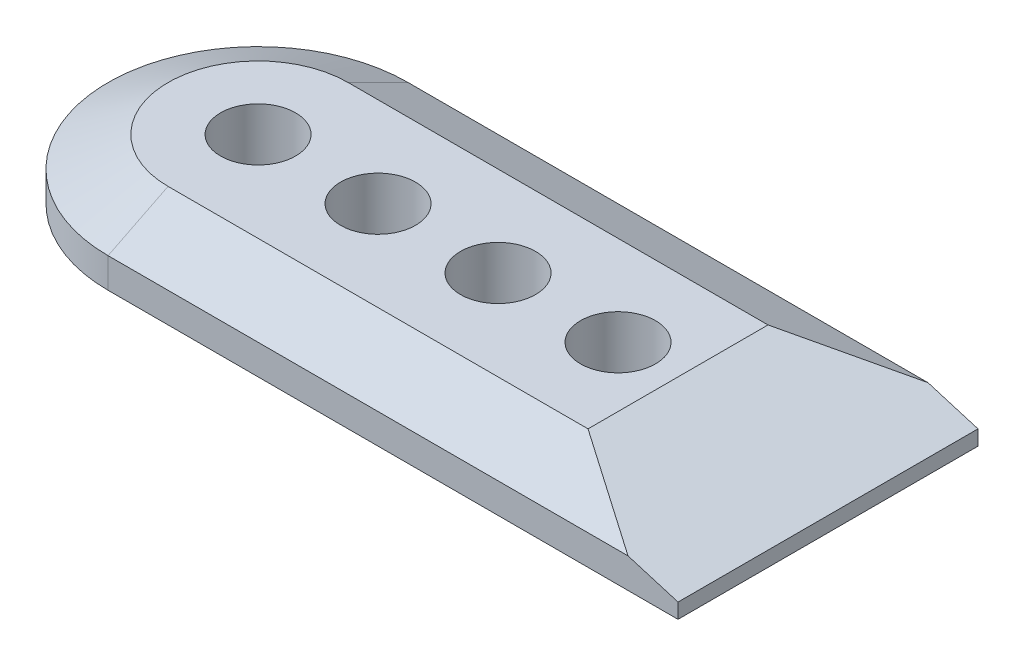
ISO-10303-21;
HEADER;
FILE_DESCRIPTION(('STEP AP214'),'2;1');
FILE_NAME('part.step','',(''),(''),'','','');
FILE_SCHEMA(('AUTOMOTIVE_DESIGN { 1 0 10303 214 1 1 1 1 }'));
ENDSEC;
DATA;
#1=APPLICATION_CONTEXT('core data for automotive mechanical design processes');
#2=APPLICATION_PROTOCOL_DEFINITION('international standard','automotive_design',2000,#1);
#3=PRODUCT_CONTEXT('',#1,'mechanical');
#4=PRODUCT('Part','Part','',(#3));
#5=PRODUCT_RELATED_PRODUCT_CATEGORY('part','',(#4));
#6=PRODUCT_DEFINITION_FORMATION('','',#4);
#7=PRODUCT_DEFINITION_CONTEXT('part definition',#1,'design');
#8=PRODUCT_DEFINITION('design','',#6,#7);
#9=PRODUCT_DEFINITION_SHAPE('','',#8);
#10=(LENGTH_UNIT() NAMED_UNIT(*) SI_UNIT(.MILLI.,.METRE.));
#11=(NAMED_UNIT(*) PLANE_ANGLE_UNIT() SI_UNIT($,.RADIAN.));
#12=(NAMED_UNIT(*) SI_UNIT($,.STERADIAN.) SOLID_ANGLE_UNIT());
#13=UNCERTAINTY_MEASURE_WITH_UNIT(LENGTH_MEASURE(1.E-05),#10,'distance_accuracy_value','');
#14=(GEOMETRIC_REPRESENTATION_CONTEXT(3) GLOBAL_UNCERTAINTY_ASSIGNED_CONTEXT((#13)) GLOBAL_UNIT_ASSIGNED_CONTEXT((#10,
#11,#12)) REPRESENTATION_CONTEXT('',''));
#15=CARTESIAN_POINT('',(0.,0.,0.));
#16=DIRECTION('',(0.,0.,1.));
#17=DIRECTION('',(1.,0.,0.));
#18=AXIS2_PLACEMENT_3D('',#15,#16,#17);
#19=CARTESIAN_POINT('',(-120.65,12.7,-31.75));
#20=DIRECTION('',(0.,-1.,0.));
#21=DIRECTION('',(0.,0.,-1.));
#22=AXIS2_PLACEMENT_3D('',#19,#20,#21);
#23=CYLINDRICAL_SURFACE('',#22,31.75);
#24=DIRECTION('',(0.,-1.,0.));
#25=VECTOR('',#24,1.);
#26=CARTESIAN_POINT('',(-120.65,12.7,0.));
#27=LINE('',#26,#25);
#28=CARTESIAN_POINT('',(-120.65,6.34999999999998,0.));
#29=VERTEX_POINT('',#28);
#30=CARTESIAN_POINT('',(-120.65,0.,0.));
#31=VERTEX_POINT('',#30);
#32=EDGE_CURVE('E97',#29,#31,#27,.T.);
#33=ORIENTED_EDGE('',*,*,#32,.F.);
#34=CARTESIAN_POINT('',(-120.65,6.34999999999998,-31.75));
#35=DIRECTION('',(0.,1.,0.));
#36=DIRECTION('',(0.,0.,1.));
#37=AXIS2_PLACEMENT_3D('',#34,#35,#36);
#38=CIRCLE('',#37,31.75);
#39=CARTESIAN_POINT('',(-120.65,6.34999999999998,-63.5));
#40=VERTEX_POINT('',#39);
#41=EDGE_CURVE('E47',#29,#40,#38,.F.);
#42=ORIENTED_EDGE('',*,*,#41,.T.);
#43=DIRECTION('',(0.,-1.,0.));
#44=VECTOR('',#43,1.);
#45=CARTESIAN_POINT('',(-120.65,12.7,-63.5));
#46=LINE('',#45,#44);
#47=CARTESIAN_POINT('',(-120.65,0.,-63.5));
#48=VERTEX_POINT('',#47);
#49=EDGE_CURVE('E118',#40,#48,#46,.T.);
#50=ORIENTED_EDGE('',*,*,#49,.T.);
#51=CARTESIAN_POINT('',(-120.65,0.,-31.75));
#52=DIRECTION('',(0.,1.,0.));
#53=DIRECTION('',(0.,0.,1.));
#54=AXIS2_PLACEMENT_3D('',#51,#52,#53);
#55=CIRCLE('',#54,31.75);
#56=EDGE_CURVE('E113',#48,#31,#55,.T.);
#57=ORIENTED_EDGE('',*,*,#56,.T.);
#58=EDGE_LOOP('',(#33,#42,#50,#57));
#59=FACE_BOUND('',#58,.T.);
#60=ADVANCED_FACE('F37',(#59),#23,.T.);
#61=CARTESIAN_POINT('',(-120.65,12.7,0.));
#62=DIRECTION('',(0.,0.,-1.));
#63=DIRECTION('',(-1.,0.,0.));
#64=AXIS2_PLACEMENT_3D('',#61,#62,#63);
#65=PLANE('',#64);
#66=DIRECTION('',(-0.957826285221152,0.287347885566343,0.));
#67=VECTOR('',#66,1.);
#68=CARTESIAN_POINT('',(-31.7500000000003,12.7,0.));
#69=LINE('',#68,#67);
#70=CARTESIAN_POINT('',(0.,3.17499999999999,0.));
#71=VERTEX_POINT('',#70);
#72=CARTESIAN_POINT('',(-10.5833333333334,6.34999999999998,0.));
#73=VERTEX_POINT('',#72);
#74=EDGE_CURVE('E140',#71,#73,#69,.T.);
#75=ORIENTED_EDGE('',*,*,#74,.T.);
#76=DIRECTION('',(-1.,0.,0.));
#77=VECTOR('',#76,1.);
#78=CARTESIAN_POINT('',(-120.65,6.34999999999998,0.));
#79=LINE('',#78,#77);
#80=EDGE_CURVE('E11',#73,#29,#79,.T.);
#81=ORIENTED_EDGE('',*,*,#80,.T.);
#82=ORIENTED_EDGE('',*,*,#32,.T.);
#83=DIRECTION('',(1.,0.,0.));
#84=VECTOR('',#83,1.);
#85=CARTESIAN_POINT('',(-120.65,0.,0.));
#86=LINE('',#85,#84);
#87=CARTESIAN_POINT('',(0.,0.,0.));
#88=VERTEX_POINT('',#87);
#89=EDGE_CURVE('E101',#31,#88,#86,.T.);
#90=ORIENTED_EDGE('',*,*,#89,.T.);
#91=DIRECTION('',(0.,-1.,0.));
#92=VECTOR('',#91,1.);
#93=CARTESIAN_POINT('',(0.,12.7,0.));
#94=LINE('',#93,#92);
#95=EDGE_CURVE('E107',#71,#88,#94,.T.);
#96=ORIENTED_EDGE('',*,*,#95,.F.);
#97=EDGE_LOOP('',(#75,#81,#82,#90,#96));
#98=FACE_BOUND('',#97,.T.);
#99=ADVANCED_FACE('F99',(#98),#65,.F.);
#100=CARTESIAN_POINT('',(0.,12.7,0.));
#101=DIRECTION('',(-1.,0.,0.));
#102=DIRECTION('',(0.,0.,1.));
#103=AXIS2_PLACEMENT_3D('',#100,#101,#102);
#104=PLANE('',#103);
#105=DIRECTION('',(0.,-1.,0.));
#106=VECTOR('',#105,1.);
#107=CARTESIAN_POINT('',(0.,12.7,-63.4999999999999));
#108=LINE('',#107,#106);
#109=CARTESIAN_POINT('',(0.,3.17499999999999,-63.4999999999999));
#110=VERTEX_POINT('',#109);
#111=CARTESIAN_POINT('',(0.,0.,-63.4999999999999));
#112=VERTEX_POINT('',#111);
#113=EDGE_CURVE('E131',#110,#112,#108,.T.);
#114=ORIENTED_EDGE('',*,*,#113,.F.);
#115=DIRECTION('',(0.,0.,1.));
#116=VECTOR('',#115,1.);
#117=CARTESIAN_POINT('',(0.,3.17499999999999,0.));
#118=LINE('',#117,#116);
#119=EDGE_CURVE('E138',#110,#71,#118,.T.);
#120=ORIENTED_EDGE('',*,*,#119,.T.);
#121=ORIENTED_EDGE('',*,*,#95,.T.);
#122=DIRECTION('',(0.,0.,-1.));
#123=VECTOR('',#122,1.);
#124=CARTESIAN_POINT('',(0.,0.,0.));
#125=LINE('',#124,#123);
#126=EDGE_CURVE('E115',#88,#112,#125,.T.);
#127=ORIENTED_EDGE('',*,*,#126,.T.);
#128=EDGE_LOOP('',(#114,#120,#121,#127));
#129=FACE_BOUND('',#128,.T.);
#130=ADVANCED_FACE('F203',(#129),#104,.F.);
#131=CARTESIAN_POINT('',(0.,12.7,-63.4999999999999));
#132=DIRECTION('',(0.,0.,1.));
#133=DIRECTION('',(1.,0.,0.));
#134=AXIS2_PLACEMENT_3D('',#131,#132,#133);
#135=PLANE('',#134);
#136=ORIENTED_EDGE('',*,*,#49,.F.);
#137=DIRECTION('',(1.,0.,0.));
#138=VECTOR('',#137,1.);
#139=CARTESIAN_POINT('',(-31.7500000000003,6.34999999999998,-63.4999999999999));
#140=LINE('',#139,#138);
#141=CARTESIAN_POINT('',(-10.5833333333334,6.34999999999998,-63.4999999999999));
#142=VERTEX_POINT('',#141);
#143=EDGE_CURVE('E149',#40,#142,#140,.T.);
#144=ORIENTED_EDGE('',*,*,#143,.T.);
#145=DIRECTION('',(0.957826285221152,-0.287347885566343,0.));
#146=VECTOR('',#145,1.);
#147=CARTESIAN_POINT('',(-31.7500000000003,12.7,-63.4999999999999));
#148=LINE('',#147,#146);
#149=EDGE_CURVE('E136',#142,#110,#148,.T.);
#150=ORIENTED_EDGE('',*,*,#149,.T.);
#151=ORIENTED_EDGE('',*,*,#113,.T.);
#152=DIRECTION('',(-1.,0.,0.));
#153=VECTOR('',#152,1.);
#154=CARTESIAN_POINT('',(0.,0.,-63.4999999999999));
#155=LINE('',#154,#153);
#156=EDGE_CURVE('E128',#112,#48,#155,.T.);
#157=ORIENTED_EDGE('',*,*,#156,.T.);
#158=EDGE_LOOP('',(#136,#144,#150,#151,#157));
#159=FACE_BOUND('',#158,.T.);
#160=ADVANCED_FACE('F191',(#159),#135,.F.);
#161=CARTESIAN_POINT('',(-120.65,12.7,-31.75));
#162=DIRECTION('',(0.,1.,0.));
#163=DIRECTION('',(0.,0.,1.));
#164=AXIS2_PLACEMENT_3D('',#161,#162,#163);
#165=PLANE('',#164);
#166=CARTESIAN_POINT('',(-120.65,12.7,-31.75));
#167=DIRECTION('',(0.,1.,0.));
#168=DIRECTION('',(0.,0.,1.));
#169=AXIS2_PLACEMENT_3D('',#166,#167,#168);
#170=CIRCLE('',#169,7.93749999999999);
#171=CARTESIAN_POINT('',(-120.65,12.7,-23.8125));
#172=VERTEX_POINT('',#171);
#173=EDGE_CURVE('E161',#172,#172,#170,.T.);
#174=ORIENTED_EDGE('',*,*,#173,.F.);
#175=EDGE_LOOP('',(#174));
#176=FACE_BOUND('',#175,.T.);
#177=CARTESIAN_POINT('',(-95.25,12.7,-31.75));
#178=DIRECTION('',(0.,1.,0.));
#179=DIRECTION('',(0.,0.,1.));
#180=AXIS2_PLACEMENT_3D('',#177,#178,#179);
#181=CIRCLE('',#180,7.93749999999998);
#182=CARTESIAN_POINT('',(-95.25,12.7,-23.8125));
#183=VERTEX_POINT('',#182);
#184=EDGE_CURVE('E171',#183,#183,#181,.T.);
#185=ORIENTED_EDGE('',*,*,#184,.F.);
#186=EDGE_LOOP('',(#185));
#187=FACE_BOUND('',#186,.T.);
#188=CARTESIAN_POINT('',(-69.85,12.7,-31.75));
#189=DIRECTION('',(0.,1.,0.));
#190=DIRECTION('',(0.,0.,1.));
#191=AXIS2_PLACEMENT_3D('',#188,#189,#190);
#192=CIRCLE('',#191,7.93749999999999);
#193=CARTESIAN_POINT('',(-69.85,12.7,-23.8125));
#194=VERTEX_POINT('',#193);
#195=EDGE_CURVE('E177',#194,#194,#192,.T.);
#196=ORIENTED_EDGE('',*,*,#195,.F.);
#197=EDGE_LOOP('',(#196));
#198=FACE_BOUND('',#197,.T.);
#199=CARTESIAN_POINT('',(-44.45,12.7,-31.75));
#200=DIRECTION('',(0.,1.,0.));
#201=DIRECTION('',(0.,0.,1.));
#202=AXIS2_PLACEMENT_3D('',#199,#200,#201);
#203=CIRCLE('',#202,7.93749999999999);
#204=CARTESIAN_POINT('',(-44.45,12.7,-23.8125));
#205=VERTEX_POINT('',#204);
#206=EDGE_CURVE('E124',#205,#205,#203,.T.);
#207=ORIENTED_EDGE('',*,*,#206,.F.);
#208=EDGE_LOOP('',(#207));
#209=FACE_BOUND('',#208,.T.);
#210=DIRECTION('',(0.,0.,-1.));
#211=VECTOR('',#210,1.);
#212=CARTESIAN_POINT('',(-31.7500000000003,12.7,-63.4999999999999));
#213=LINE('',#212,#211);
#214=CARTESIAN_POINT('',(-31.7500000000004,12.7,-12.7000000000001));
#215=VERTEX_POINT('',#214);
#216=CARTESIAN_POINT('',(-31.7500000000003,12.7,-50.7999999999998));
#217=VERTEX_POINT('',#216);
#218=EDGE_CURVE('E106',#215,#217,#213,.T.);
#219=ORIENTED_EDGE('',*,*,#218,.T.);
#220=DIRECTION('',(-1.,0.,0.));
#221=VECTOR('',#220,1.);
#222=CARTESIAN_POINT('',(-120.65,12.7,-50.7999999999998));
#223=LINE('',#222,#221);
#224=CARTESIAN_POINT('',(-120.65,12.7,-50.7999999999998));
#225=VERTEX_POINT('',#224);
#226=EDGE_CURVE('E146',#217,#225,#223,.T.);
#227=ORIENTED_EDGE('',*,*,#226,.T.);
#228=CARTESIAN_POINT('',(-120.65,12.7,-31.75));
#229=DIRECTION('',(0.,1.,0.));
#230=DIRECTION('',(0.,0.,1.));
#231=AXIS2_PLACEMENT_3D('',#228,#229,#230);
#232=CIRCLE('',#231,19.0499999999999);
#233=CARTESIAN_POINT('',(-120.65,12.7,-12.7000000000001));
#234=VERTEX_POINT('',#233);
#235=EDGE_CURVE('E144',#225,#234,#232,.T.);
#236=ORIENTED_EDGE('',*,*,#235,.T.);
#237=DIRECTION('',(1.,0.,0.));
#238=VECTOR('',#237,1.);
#239=CARTESIAN_POINT('',(-31.7500000000004,12.7,-12.7000000000001));
#240=LINE('',#239,#238);
#241=EDGE_CURVE('E142',#234,#215,#240,.T.);
#242=ORIENTED_EDGE('',*,*,#241,.T.);
#243=EDGE_LOOP('',(#219,#227,#236,#242));
#244=FACE_BOUND('',#243,.T.);
#245=ADVANCED_FACE('F188',(#176,#187,#198,#209,#244),#165,.T.);
#246=CARTESIAN_POINT('',(-120.65,0.,-31.75));
#247=DIRECTION('',(0.,1.,0.));
#248=DIRECTION('',(0.,0.,1.));
#249=AXIS2_PLACEMENT_3D('',#246,#247,#248);
#250=PLANE('',#249);
#251=CARTESIAN_POINT('',(-120.65,0.,-31.75));
#252=DIRECTION('',(0.,1.,0.));
#253=DIRECTION('',(0.,0.,1.));
#254=AXIS2_PLACEMENT_3D('',#251,#252,#253);
#255=CIRCLE('',#254,7.93749999999999);
#256=CARTESIAN_POINT('',(-120.65,0.,-23.8125));
#257=VERTEX_POINT('',#256);
#258=EDGE_CURVE('E154',#257,#257,#255,.T.);
#259=ORIENTED_EDGE('',*,*,#258,.T.);
#260=EDGE_LOOP('',(#259));
#261=FACE_BOUND('',#260,.T.);
#262=CARTESIAN_POINT('',(-95.25,0.,-31.75));
#263=DIRECTION('',(0.,1.,0.));
#264=DIRECTION('',(0.,0.,1.));
#265=AXIS2_PLACEMENT_3D('',#262,#263,#264);
#266=CIRCLE('',#265,7.93749999999998);
#267=CARTESIAN_POINT('',(-95.25,0.,-23.8125));
#268=VERTEX_POINT('',#267);
#269=EDGE_CURVE('E166',#268,#268,#266,.T.);
#270=ORIENTED_EDGE('',*,*,#269,.T.);
#271=EDGE_LOOP('',(#270));
#272=FACE_BOUND('',#271,.T.);
#273=CARTESIAN_POINT('',(-69.85,0.,-31.75));
#274=DIRECTION('',(0.,1.,0.));
#275=DIRECTION('',(0.,0.,1.));
#276=AXIS2_PLACEMENT_3D('',#273,#274,#275);
#277=CIRCLE('',#276,7.93749999999999);
#278=CARTESIAN_POINT('',(-69.85,0.,-23.8125));
#279=VERTEX_POINT('',#278);
#280=EDGE_CURVE('E174',#279,#279,#277,.T.);
#281=ORIENTED_EDGE('',*,*,#280,.T.);
#282=EDGE_LOOP('',(#281));
#283=FACE_BOUND('',#282,.T.);
#284=CARTESIAN_POINT('',(-44.45,0.,-31.75));
#285=DIRECTION('',(0.,1.,0.));
#286=DIRECTION('',(0.,0.,1.));
#287=AXIS2_PLACEMENT_3D('',#284,#285,#286);
#288=CIRCLE('',#287,7.93749999999999);
#289=CARTESIAN_POINT('',(-44.45,0.,-23.8125));
#290=VERTEX_POINT('',#289);
#291=EDGE_CURVE('E179',#290,#290,#288,.T.);
#292=ORIENTED_EDGE('',*,*,#291,.T.);
#293=EDGE_LOOP('',(#292));
#294=FACE_BOUND('',#293,.T.);
#295=ORIENTED_EDGE('',*,*,#56,.F.);
#296=ORIENTED_EDGE('',*,*,#156,.F.);
#297=ORIENTED_EDGE('',*,*,#126,.F.);
#298=ORIENTED_EDGE('',*,*,#89,.F.);
#299=EDGE_LOOP('',(#295,#296,#297,#298));
#300=FACE_BOUND('',#299,.T.);
#301=ADVANCED_FACE('F111',(#261,#272,#283,#294,#300),#250,.F.);
#302=CARTESIAN_POINT('',(-31.7500000000003,12.7,-31.75));
#303=DIRECTION('',(0.287347885566343,0.957826285221152,0.));
#304=DIRECTION('',(0.,0.,1.));
#305=AXIS2_PLACEMENT_3D('',#302,#303,#304);
#306=PLANE('',#305);
#307=ORIENTED_EDGE('',*,*,#149,.F.);
#308=DIRECTION('',(-0.830454798537401,0.249136439561218,0.498272879122438));
#309=VECTOR('',#308,1.);
#310=CARTESIAN_POINT('',(-39.6327586206899,15.0648275862068,-46.0703448275861));
#311=LINE('',#310,#309);
#312=EDGE_CURVE('E152',#142,#217,#311,.T.);
#313=ORIENTED_EDGE('',*,*,#312,.T.);
#314=ORIENTED_EDGE('',*,*,#218,.F.);
#315=DIRECTION('',(0.830454798537401,-0.249136439561218,0.498272879122439));
#316=VECTOR('',#315,1.);
#317=CARTESIAN_POINT('',(-39.6327586206899,15.0648275862068,-17.4296551724139));
#318=LINE('',#317,#316);
#319=EDGE_CURVE('E61',#215,#73,#318,.T.);
#320=ORIENTED_EDGE('',*,*,#319,.T.);
#321=ORIENTED_EDGE('',*,*,#74,.F.);
#322=ORIENTED_EDGE('',*,*,#119,.F.);
#323=EDGE_LOOP('',(#307,#313,#314,#320,#321,#322));
#324=FACE_BOUND('',#323,.T.);
#325=ADVANCED_FACE('F198',(#324),#306,.T.);
#326=CARTESIAN_POINT('',(-120.65,12.7,-12.7000000000001));
#327=DIRECTION('',(0.,0.894427190999917,0.447213595499956));
#328=DIRECTION('',(-1.,0.,0.));
#329=AXIS2_PLACEMENT_3D('',#326,#327,#328);
#330=PLANE('',#329);
#331=ORIENTED_EDGE('',*,*,#319,.F.);
#332=ORIENTED_EDGE('',*,*,#241,.F.);
#333=DIRECTION('',(0.,0.447213595499956,-0.894427190999917));
#334=VECTOR('',#333,1.);
#335=CARTESIAN_POINT('',(-120.65,6.34999999999998,0.));
#336=LINE('',#335,#334);
#337=EDGE_CURVE('E42',#29,#234,#336,.T.);
#338=ORIENTED_EDGE('',*,*,#337,.F.);
#339=ORIENTED_EDGE('',*,*,#80,.F.);
#340=EDGE_LOOP('',(#331,#332,#338,#339));
#341=FACE_BOUND('',#340,.T.);
#342=ADVANCED_FACE('F40',(#341),#330,.T.);
#343=CARTESIAN_POINT('',(-120.65,12.7,-31.75));
#344=DIRECTION('',(0.,-1.,0.));
#345=DIRECTION('',(0.,0.,-1.));
#346=AXIS2_PLACEMENT_3D('',#343,#344,#345);
#347=CONICAL_SURFACE('',#346,19.0499999999999,1.10714871779409);
#348=ORIENTED_EDGE('',*,*,#337,.T.);
#349=ORIENTED_EDGE('',*,*,#235,.F.);
#350=DIRECTION('',(0.,0.447213595499956,0.894427190999917));
#351=VECTOR('',#350,1.);
#352=CARTESIAN_POINT('',(-120.65,6.34999999999998,-63.5));
#353=LINE('',#352,#351);
#354=EDGE_CURVE('E122',#40,#225,#353,.T.);
#355=ORIENTED_EDGE('',*,*,#354,.F.);
#356=ORIENTED_EDGE('',*,*,#41,.F.);
#357=EDGE_LOOP('',(#348,#349,#355,#356));
#358=FACE_BOUND('',#357,.T.);
#359=ADVANCED_FACE('F207',(#358),#347,.T.);
#360=CARTESIAN_POINT('',(-120.65,12.7,-50.7999999999998));
#361=DIRECTION('',(0.,0.894427190999917,-0.447213595499956));
#362=DIRECTION('',(1.,0.,0.));
#363=AXIS2_PLACEMENT_3D('',#360,#361,#362);
#364=PLANE('',#363);
#365=ORIENTED_EDGE('',*,*,#312,.F.);
#366=ORIENTED_EDGE('',*,*,#143,.F.);
#367=ORIENTED_EDGE('',*,*,#354,.T.);
#368=ORIENTED_EDGE('',*,*,#226,.F.);
#369=EDGE_LOOP('',(#365,#366,#367,#368));
#370=FACE_BOUND('',#369,.T.);
#371=ADVANCED_FACE('F196',(#370),#364,.T.);
#372=CARTESIAN_POINT('',(-44.45,0.,-31.75));
#373=DIRECTION('',(0.,1.,0.));
#374=DIRECTION('',(0.,0.,1.));
#375=AXIS2_PLACEMENT_3D('',#372,#373,#374);
#376=CYLINDRICAL_SURFACE('',#375,7.93749999999999);
#377=ORIENTED_EDGE('',*,*,#291,.F.);
#378=EDGE_LOOP('',(#377));
#379=FACE_BOUND('',#378,.T.);
#380=ORIENTED_EDGE('',*,*,#206,.T.);
#381=EDGE_LOOP('',(#380));
#382=FACE_BOUND('',#381,.T.);
#383=ADVANCED_FACE('F186',(#379,#382),#376,.F.);
#384=CARTESIAN_POINT('',(-69.85,0.,-31.75));
#385=DIRECTION('',(0.,1.,0.));
#386=DIRECTION('',(0.,0.,1.));
#387=AXIS2_PLACEMENT_3D('',#384,#385,#386);
#388=CYLINDRICAL_SURFACE('',#387,7.93749999999999);
#389=ORIENTED_EDGE('',*,*,#280,.F.);
#390=EDGE_LOOP('',(#389));
#391=FACE_BOUND('',#390,.T.);
#392=ORIENTED_EDGE('',*,*,#195,.T.);
#393=EDGE_LOOP('',(#392));
#394=FACE_BOUND('',#393,.T.);
#395=ADVANCED_FACE('F274',(#391,#394),#388,.F.);
#396=CARTESIAN_POINT('',(-95.25,0.,-31.75));
#397=DIRECTION('',(0.,1.,0.));
#398=DIRECTION('',(0.,0.,1.));
#399=AXIS2_PLACEMENT_3D('',#396,#397,#398);
#400=CYLINDRICAL_SURFACE('',#399,7.93749999999998);
#401=ORIENTED_EDGE('',*,*,#269,.F.);
#402=EDGE_LOOP('',(#401));
#403=FACE_BOUND('',#402,.T.);
#404=ORIENTED_EDGE('',*,*,#184,.T.);
#405=EDGE_LOOP('',(#404));
#406=FACE_BOUND('',#405,.T.);
#407=ADVANCED_FACE('F283',(#403,#406),#400,.F.);
#408=CARTESIAN_POINT('',(-120.65,0.,-31.75));
#409=DIRECTION('',(0.,1.,0.));
#410=DIRECTION('',(0.,0.,1.));
#411=AXIS2_PLACEMENT_3D('',#408,#409,#410);
#412=CYLINDRICAL_SURFACE('',#411,7.93749999999999);
#413=ORIENTED_EDGE('',*,*,#258,.F.);
#414=EDGE_LOOP('',(#413));
#415=FACE_BOUND('',#414,.T.);
#416=ORIENTED_EDGE('',*,*,#173,.T.);
#417=EDGE_LOOP('',(#416));
#418=FACE_BOUND('',#417,.T.);
#419=ADVANCED_FACE('F293',(#415,#418),#412,.F.);
#420=CLOSED_SHELL('',(#60,#99,#130,#160,#245,#301,#325,#342,#359,#371,#383,#395,#407,#419));
#421=MANIFOLD_SOLID_BREP('B2',#420);
#422=ADVANCED_BREP_SHAPE_REPRESENTATION('',(#18,#421),#14);
#423=SHAPE_DEFINITION_REPRESENTATION(#9,#422);
ENDSEC;
END-ISO-10303-21;
